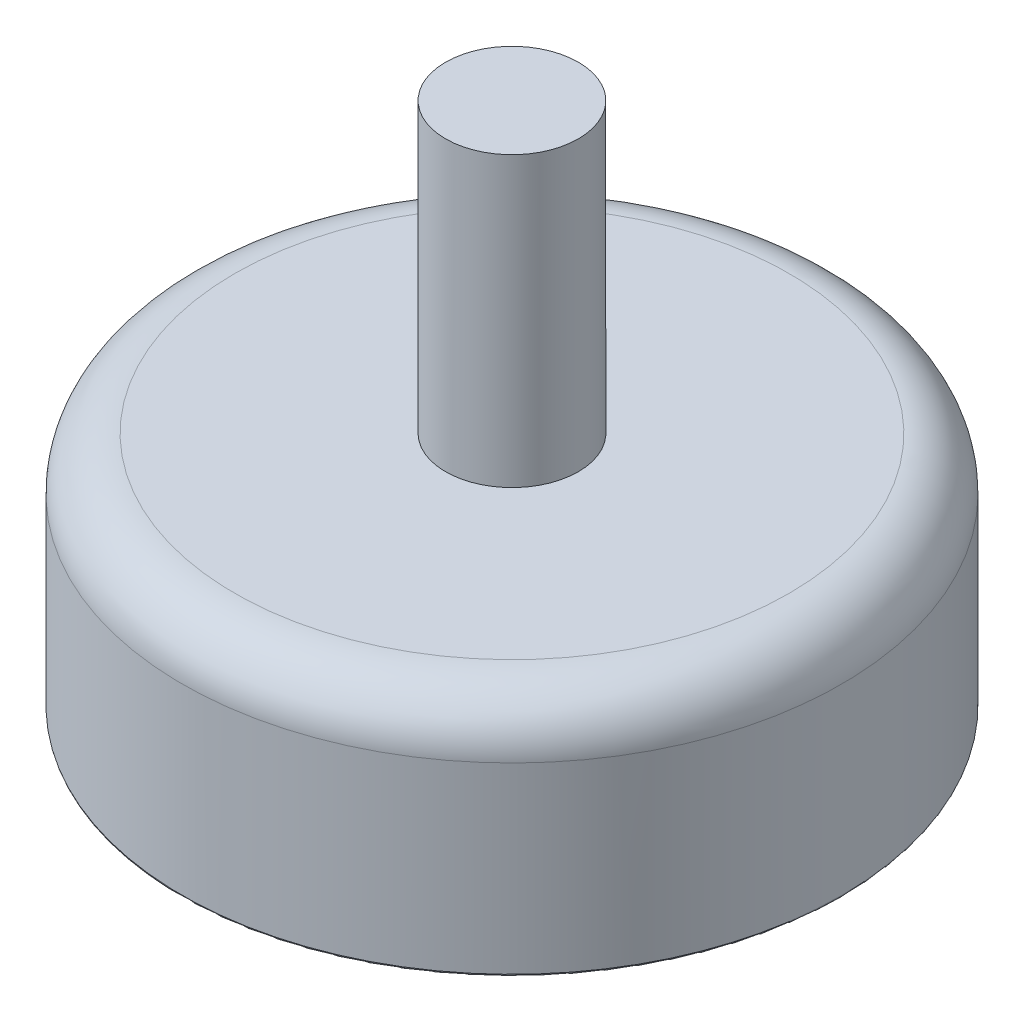
ISO-10303-21;
HEADER;
FILE_DESCRIPTION(('STEP AP214'),'2;1');
FILE_NAME('part.step','',(''),(''),'','','');
FILE_SCHEMA(('AUTOMOTIVE_DESIGN { 1 0 10303 214 1 1 1 1 }'));
ENDSEC;
DATA;
#1=APPLICATION_CONTEXT('core data for automotive mechanical design processes');
#2=APPLICATION_PROTOCOL_DEFINITION('international standard','automotive_design',2000,#1);
#3=PRODUCT_CONTEXT('',#1,'mechanical');
#4=PRODUCT('Part','Part','',(#3));
#5=PRODUCT_RELATED_PRODUCT_CATEGORY('part','',(#4));
#6=PRODUCT_DEFINITION_FORMATION('','',#4);
#7=PRODUCT_DEFINITION_CONTEXT('part definition',#1,'design');
#8=PRODUCT_DEFINITION('design','',#6,#7);
#9=PRODUCT_DEFINITION_SHAPE('','',#8);
#10=(LENGTH_UNIT() NAMED_UNIT(*) SI_UNIT(.MILLI.,.METRE.));
#11=(NAMED_UNIT(*) PLANE_ANGLE_UNIT() SI_UNIT($,.RADIAN.));
#12=(NAMED_UNIT(*) SI_UNIT($,.STERADIAN.) SOLID_ANGLE_UNIT());
#13=UNCERTAINTY_MEASURE_WITH_UNIT(LENGTH_MEASURE(1.E-05),#10,'distance_accuracy_value','');
#14=(GEOMETRIC_REPRESENTATION_CONTEXT(3) GLOBAL_UNCERTAINTY_ASSIGNED_CONTEXT((#13)) GLOBAL_UNIT_ASSIGNED_CONTEXT((#10,
#11,#12)) REPRESENTATION_CONTEXT('',''));
#15=CARTESIAN_POINT('',(0.,0.,0.));
#16=DIRECTION('',(0.,0.,1.));
#17=DIRECTION('',(1.,0.,0.));
#18=AXIS2_PLACEMENT_3D('',#15,#16,#17);
#19=CARTESIAN_POINT('',(0.,6.79999999999999,0.));
#20=DIRECTION('',(0.,-1.,0.));
#21=DIRECTION('',(1.,0.,0.));
#22=AXIS2_PLACEMENT_3D('',#19,#20,#21);
#23=PLANE('',#22);
#24=CARTESIAN_POINT('',(0.,6.79999999999999,0.));
#25=DIRECTION('',(0.,-1.,0.));
#26=DIRECTION('',(1.,0.,0.));
#27=AXIS2_PLACEMENT_3D('',#24,#25,#26);
#28=CIRCLE('',#27,1.9);
#29=CARTESIAN_POINT('',(1.90000000000001,6.79999999999999,0.));
#30=VERTEX_POINT('',#29);
#31=EDGE_CURVE('E79',#30,#30,#28,.F.);
#32=ORIENTED_EDGE('',*,*,#31,.F.);
#33=EDGE_LOOP('',(#32));
#34=FACE_BOUND('',#33,.T.);
#35=CARTESIAN_POINT('',(0.,6.79999999999999,0.));
#36=DIRECTION('',(0.,1.,0.));
#37=DIRECTION('',(-1.,0.,0.));
#38=AXIS2_PLACEMENT_3D('',#35,#36,#37);
#39=CIRCLE('',#38,7.93);
#40=CARTESIAN_POINT('',(-7.92999999999999,6.8,0.));
#41=VERTEX_POINT('',#40);
#42=EDGE_CURVE('E83',#41,#41,#39,.T.);
#43=ORIENTED_EDGE('',*,*,#42,.T.);
#44=EDGE_LOOP('',(#43));
#45=FACE_BOUND('',#44,.T.);
#46=ADVANCED_FACE('F39',(#34,#45),#23,.F.);
#47=CARTESIAN_POINT('',(0.,5.29999999999999,0.));
#48=DIRECTION('',(0.,1.,0.));
#49=DIRECTION('',(-1.,0.,0.));
#50=AXIS2_PLACEMENT_3D('',#47,#48,#49);
#51=TOROIDAL_SURFACE('',#50,7.93000000000001,1.5);
#52=CARTESIAN_POINT('',(0.,5.29999999999997,0.));
#53=DIRECTION('',(0.,1.,0.));
#54=DIRECTION('',(-1.,0.,0.));
#55=AXIS2_PLACEMENT_3D('',#52,#53,#54);
#56=CIRCLE('',#55,9.43000000000001);
#57=CARTESIAN_POINT('',(-9.43,5.29999999999999,0.));
#58=VERTEX_POINT('',#57);
#59=EDGE_CURVE('E87',#58,#58,#56,.T.);
#60=ORIENTED_EDGE('',*,*,#59,.T.);
#61=EDGE_LOOP('',(#60));
#62=FACE_BOUND('',#61,.T.);
#63=ORIENTED_EDGE('',*,*,#42,.F.);
#64=EDGE_LOOP('',(#63));
#65=FACE_BOUND('',#64,.T.);
#66=ADVANCED_FACE('F111',(#62,#65),#51,.T.);
#67=CARTESIAN_POINT('',(0.,6.8,0.));
#68=DIRECTION('',(0.,1.,0.));
#69=DIRECTION('',(-1.,0.,0.));
#70=AXIS2_PLACEMENT_3D('',#67,#68,#69);
#71=CYLINDRICAL_SURFACE('',#70,9.43);
#72=CARTESIAN_POINT('',(0.,0.0634999999999872,0.));
#73=DIRECTION('',(0.,-1.,0.));
#74=DIRECTION('',(1.,0.,0.));
#75=AXIS2_PLACEMENT_3D('',#72,#73,#74);
#76=CIRCLE('',#75,9.43);
#77=CARTESIAN_POINT('',(9.43,0.0634999999999732,0.));
#78=VERTEX_POINT('',#77);
#79=EDGE_CURVE('E67',#78,#78,#76,.F.);
#80=ORIENTED_EDGE('',*,*,#79,.T.);
#81=EDGE_LOOP('',(#80));
#82=FACE_BOUND('',#81,.T.);
#83=ORIENTED_EDGE('',*,*,#59,.F.);
#84=EDGE_LOOP('',(#83));
#85=FACE_BOUND('',#84,.T.);
#86=ADVANCED_FACE('F116',(#82,#85),#71,.T.);
#87=CARTESIAN_POINT('',(0.,0.,0.));
#88=DIRECTION('',(0.,-1.,0.));
#89=DIRECTION('',(1.,0.,0.));
#90=AXIS2_PLACEMENT_3D('',#87,#88,#89);
#91=PLANE('',#90);
#92=CARTESIAN_POINT('',(0.,0.,0.));
#93=DIRECTION('',(0.,-1.,0.));
#94=DIRECTION('',(1.,0.,0.));
#95=AXIS2_PLACEMENT_3D('',#92,#93,#94);
#96=CIRCLE('',#95,9.3665);
#97=CARTESIAN_POINT('',(9.3665,0.,0.));
#98=VERTEX_POINT('',#97);
#99=EDGE_CURVE('E57',#98,#98,#96,.T.);
#100=ORIENTED_EDGE('',*,*,#99,.T.);
#101=EDGE_LOOP('',(#100));
#102=FACE_BOUND('',#101,.T.);
#103=CARTESIAN_POINT('',(0.,0.,0.));
#104=DIRECTION('',(0.,-1.,0.));
#105=DIRECTION('',(1.,0.,0.));
#106=AXIS2_PLACEMENT_3D('',#103,#104,#105);
#107=CIRCLE('',#106,8.2235);
#108=CARTESIAN_POINT('',(8.2235,0.,0.));
#109=VERTEX_POINT('',#108);
#110=EDGE_CURVE('E63',#109,#109,#107,.F.);
#111=ORIENTED_EDGE('',*,*,#110,.T.);
#112=EDGE_LOOP('',(#111));
#113=FACE_BOUND('',#112,.T.);
#114=ADVANCED_FACE('F122',(#102,#113),#91,.T.);
#115=CARTESIAN_POINT('',(0.,6.8,0.));
#116=DIRECTION('',(0.,1.,0.));
#117=DIRECTION('',(-1.,0.,0.));
#118=AXIS2_PLACEMENT_3D('',#115,#116,#117);
#119=CYLINDRICAL_SURFACE('',#118,8.16);
#120=CARTESIAN_POINT('',(0.,0.536499999999989,0.));
#121=DIRECTION('',(0.,-1.,0.));
#122=DIRECTION('',(1.,0.,0.));
#123=AXIS2_PLACEMENT_3D('',#120,#121,#122);
#124=CIRCLE('',#123,8.16);
#125=CARTESIAN_POINT('',(8.16,0.536499999999977,0.));
#126=VERTEX_POINT('',#125);
#127=EDGE_CURVE('E47',#126,#126,#124,.F.);
#128=ORIENTED_EDGE('',*,*,#127,.T.);
#129=EDGE_LOOP('',(#128));
#130=FACE_BOUND('',#129,.T.);
#131=CARTESIAN_POINT('',(0.,0.0634999999999872,0.));
#132=DIRECTION('',(0.,-1.,0.));
#133=DIRECTION('',(1.,0.,0.));
#134=AXIS2_PLACEMENT_3D('',#131,#132,#133);
#135=CIRCLE('',#134,8.16);
#136=CARTESIAN_POINT('',(8.16,0.0634999999999751,0.));
#137=VERTEX_POINT('',#136);
#138=EDGE_CURVE('E52',#137,#137,#135,.T.);
#139=ORIENTED_EDGE('',*,*,#138,.T.);
#140=EDGE_LOOP('',(#139));
#141=FACE_BOUND('',#140,.T.);
#142=ADVANCED_FACE('F149',(#130,#141),#119,.F.);
#143=CARTESIAN_POINT('',(0.,0.599999999999989,0.));
#144=DIRECTION('',(0.,-1.,0.));
#145=DIRECTION('',(1.,0.,0.));
#146=AXIS2_PLACEMENT_3D('',#143,#144,#145);
#147=PLANE('',#146);
#148=CARTESIAN_POINT('',(0.,0.599999999999989,0.));
#149=DIRECTION('',(0.,-1.,0.));
#150=DIRECTION('',(1.,0.,0.));
#151=AXIS2_PLACEMENT_3D('',#148,#149,#150);
#152=CIRCLE('',#151,8.0965);
#153=CARTESIAN_POINT('',(8.0965,0.599999999999977,0.));
#154=VERTEX_POINT('',#153);
#155=EDGE_CURVE('E10',#154,#154,#152,.T.);
#156=ORIENTED_EDGE('',*,*,#155,.T.);
#157=EDGE_LOOP('',(#156));
#158=FACE_BOUND('',#157,.T.);
#159=CARTESIAN_POINT('',(0.,0.599999999999989,0.));
#160=DIRECTION('',(0.,1.,0.));
#161=DIRECTION('',(-1.,0.,0.));
#162=AXIS2_PLACEMENT_3D('',#159,#160,#161);
#163=CIRCLE('',#162,6.8);
#164=CARTESIAN_POINT('',(-6.8,0.6,0.));
#165=VERTEX_POINT('',#164);
#166=EDGE_CURVE('E91',#165,#165,#163,.T.);
#167=ORIENTED_EDGE('',*,*,#166,.T.);
#168=EDGE_LOOP('',(#167));
#169=FACE_BOUND('',#168,.T.);
#170=ADVANCED_FACE('F154',(#158,#169),#147,.T.);
#171=CARTESIAN_POINT('',(0.,6.8,0.));
#172=DIRECTION('',(0.,1.,0.));
#173=DIRECTION('',(-1.,0.,0.));
#174=AXIS2_PLACEMENT_3D('',#171,#172,#173);
#175=CYLINDRICAL_SURFACE('',#174,6.8);
#176=CARTESIAN_POINT('',(0.,0.563499999999995,0.));
#177=DIRECTION('',(0.,-1.,0.));
#178=DIRECTION('',(1.,0.,0.));
#179=AXIS2_PLACEMENT_3D('',#176,#177,#178);
#180=CIRCLE('',#179,6.8);
#181=CARTESIAN_POINT('',(6.8,0.563499999999984,0.));
#182=VERTEX_POINT('',#181);
#183=EDGE_CURVE('E75',#182,#182,#180,.F.);
#184=ORIENTED_EDGE('',*,*,#183,.T.);
#185=EDGE_LOOP('',(#184));
#186=FACE_BOUND('',#185,.T.);
#187=ORIENTED_EDGE('',*,*,#166,.F.);
#188=EDGE_LOOP('',(#187));
#189=FACE_BOUND('',#188,.T.);
#190=ADVANCED_FACE('F159',(#186,#189),#175,.T.);
#191=CARTESIAN_POINT('',(0.,0.499999999999995,0.));
#192=DIRECTION('',(0.,-1.,0.));
#193=DIRECTION('',(1.,0.,0.));
#194=AXIS2_PLACEMENT_3D('',#191,#192,#193);
#195=PLANE('',#194);
#196=CARTESIAN_POINT('',(0.,0.499999999999995,0.));
#197=DIRECTION('',(0.,-1.,0.));
#198=DIRECTION('',(1.,0.,0.));
#199=AXIS2_PLACEMENT_3D('',#196,#197,#198);
#200=CIRCLE('',#199,6.7365);
#201=CARTESIAN_POINT('',(6.7365,0.499999999999985,0.));
#202=VERTEX_POINT('',#201);
#203=EDGE_CURVE('E71',#202,#202,#200,.T.);
#204=ORIENTED_EDGE('',*,*,#203,.T.);
#205=EDGE_LOOP('',(#204));
#206=FACE_BOUND('',#205,.T.);
#207=ADVANCED_FACE('F105',(#206),#195,.T.);
#208=CARTESIAN_POINT('',(0.,15.05,0.));
#209=DIRECTION('',(0.,-1.,0.));
#210=DIRECTION('',(1.,0.,0.));
#211=AXIS2_PLACEMENT_3D('',#208,#209,#210);
#212=CYLINDRICAL_SURFACE('',#211,1.9);
#213=CARTESIAN_POINT('',(0.,15.05,0.));
#214=DIRECTION('',(0.,1.,0.));
#215=DIRECTION('',(-1.,0.,0.));
#216=AXIS2_PLACEMENT_3D('',#213,#214,#215);
#217=CIRCLE('',#216,1.9);
#218=CARTESIAN_POINT('',(-1.89999999999998,15.05,0.));
#219=VERTEX_POINT('',#218);
#220=EDGE_CURVE('E95',#219,#219,#217,.T.);
#221=ORIENTED_EDGE('',*,*,#220,.F.);
#222=EDGE_LOOP('',(#221));
#223=FACE_BOUND('',#222,.T.);
#224=ORIENTED_EDGE('',*,*,#31,.T.);
#225=EDGE_LOOP('',(#224));
#226=FACE_BOUND('',#225,.T.);
#227=ADVANCED_FACE('F102',(#223,#226),#212,.T.);
#228=CARTESIAN_POINT('',(0.,15.05,0.));
#229=DIRECTION('',(0.,1.,0.));
#230=DIRECTION('',(-1.,0.,0.));
#231=AXIS2_PLACEMENT_3D('',#228,#229,#230);
#232=PLANE('',#231);
#233=ORIENTED_EDGE('',*,*,#220,.T.);
#234=EDGE_LOOP('',(#233));
#235=FACE_BOUND('',#234,.T.);
#236=ADVANCED_FACE('F100',(#235),#232,.T.);
#237=CARTESIAN_POINT('',(0.,0.563499999999995,0.));
#238=DIRECTION('',(0.,-1.,0.));
#239=DIRECTION('',(1.,0.,0.));
#240=AXIS2_PLACEMENT_3D('',#237,#238,#239);
#241=TOROIDAL_SURFACE('',#240,6.7365,0.0635);
#242=ORIENTED_EDGE('',*,*,#203,.F.);
#243=EDGE_LOOP('',(#242));
#244=FACE_BOUND('',#243,.T.);
#245=ORIENTED_EDGE('',*,*,#183,.F.);
#246=EDGE_LOOP('',(#245));
#247=FACE_BOUND('',#246,.T.);
#248=ADVANCED_FACE('F127',(#244,#247),#241,.T.);
#249=CARTESIAN_POINT('',(0.,0.0634999999999872,0.));
#250=DIRECTION('',(0.,-1.,0.));
#251=DIRECTION('',(1.,0.,0.));
#252=AXIS2_PLACEMENT_3D('',#249,#250,#251);
#253=TOROIDAL_SURFACE('',#252,9.3665,0.0635);
#254=ORIENTED_EDGE('',*,*,#99,.F.);
#255=EDGE_LOOP('',(#254));
#256=FACE_BOUND('',#255,.T.);
#257=ORIENTED_EDGE('',*,*,#79,.F.);
#258=EDGE_LOOP('',(#257));
#259=FACE_BOUND('',#258,.T.);
#260=ADVANCED_FACE('F130',(#256,#259),#253,.T.);
#261=CARTESIAN_POINT('',(0.,0.536499999999989,0.));
#262=DIRECTION('',(0.,-1.,0.));
#263=DIRECTION('',(1.,0.,0.));
#264=AXIS2_PLACEMENT_3D('',#261,#262,#263);
#265=TOROIDAL_SURFACE('',#264,8.0965,0.0635);
#266=ORIENTED_EDGE('',*,*,#155,.F.);
#267=EDGE_LOOP('',(#266));
#268=FACE_BOUND('',#267,.T.);
#269=ORIENTED_EDGE('',*,*,#127,.F.);
#270=EDGE_LOOP('',(#269));
#271=FACE_BOUND('',#270,.T.);
#272=ADVANCED_FACE('F133',(#268,#271),#265,.F.);
#273=CARTESIAN_POINT('',(0.,0.0634999999999872,0.));
#274=DIRECTION('',(0.,-1.,0.));
#275=DIRECTION('',(1.,0.,0.));
#276=AXIS2_PLACEMENT_3D('',#273,#274,#275);
#277=TOROIDAL_SURFACE('',#276,8.2235,0.0635);
#278=ORIENTED_EDGE('',*,*,#138,.F.);
#279=EDGE_LOOP('',(#278));
#280=FACE_BOUND('',#279,.T.);
#281=ORIENTED_EDGE('',*,*,#110,.F.);
#282=EDGE_LOOP('',(#281));
#283=FACE_BOUND('',#282,.T.);
#284=ADVANCED_FACE('F41',(#280,#283),#277,.T.);
#285=CLOSED_SHELL('',(#46,#66,#86,#114,#142,#170,#190,#207,#227,#236,#248,#260,#272,#284));
#286=MANIFOLD_SOLID_BREP('B2',#285);
#287=ADVANCED_BREP_SHAPE_REPRESENTATION('',(#18,#286),#14);
#288=SHAPE_DEFINITION_REPRESENTATION(#9,#287);
ENDSEC;
END-ISO-10303-21;
